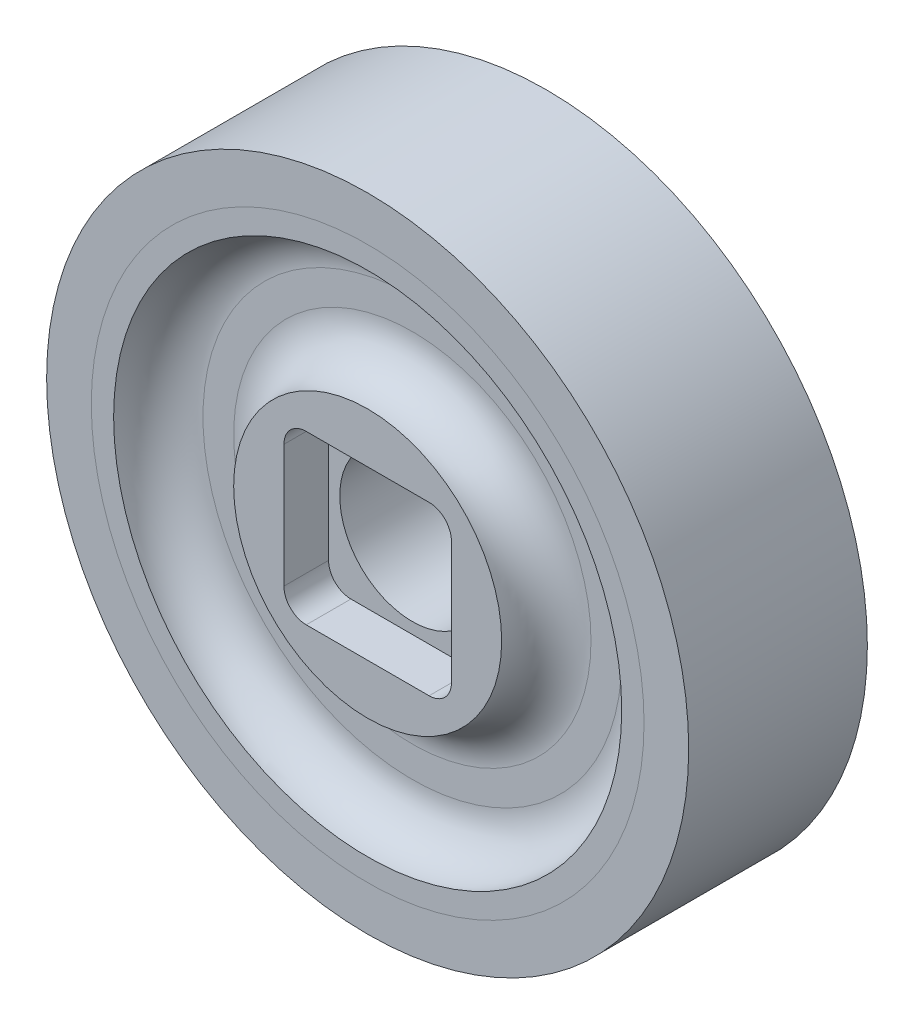
ISO-10303-21;
HEADER;
FILE_DESCRIPTION(('STEP AP214'),'2;1');
FILE_NAME('part.step','',(''),(''),'','','');
FILE_SCHEMA(('AUTOMOTIVE_DESIGN { 1 0 10303 214 1 1 1 1 }'));
ENDSEC;
DATA;
#1=APPLICATION_CONTEXT('core data for automotive mechanical design processes');
#2=APPLICATION_PROTOCOL_DEFINITION('international standard','automotive_design',2000,#1);
#3=PRODUCT_CONTEXT('',#1,'mechanical');
#4=PRODUCT('Part','Part','',(#3));
#5=PRODUCT_RELATED_PRODUCT_CATEGORY('part','',(#4));
#6=PRODUCT_DEFINITION_FORMATION('','',#4);
#7=PRODUCT_DEFINITION_CONTEXT('part definition',#1,'design');
#8=PRODUCT_DEFINITION('design','',#6,#7);
#9=PRODUCT_DEFINITION_SHAPE('','',#8);
#10=(LENGTH_UNIT() NAMED_UNIT(*) SI_UNIT(.MILLI.,.METRE.));
#11=(NAMED_UNIT(*) PLANE_ANGLE_UNIT() SI_UNIT($,.RADIAN.));
#12=(NAMED_UNIT(*) SI_UNIT($,.STERADIAN.) SOLID_ANGLE_UNIT());
#13=UNCERTAINTY_MEASURE_WITH_UNIT(LENGTH_MEASURE(1.E-05),#10,'distance_accuracy_value','');
#14=(GEOMETRIC_REPRESENTATION_CONTEXT(3) GLOBAL_UNCERTAINTY_ASSIGNED_CONTEXT((#13)) GLOBAL_UNIT_ASSIGNED_CONTEXT((#10,
#11,#12)) REPRESENTATION_CONTEXT('',''));
#15=CARTESIAN_POINT('',(0.,0.,0.));
#16=DIRECTION('',(0.,0.,1.));
#17=DIRECTION('',(1.,0.,0.));
#18=AXIS2_PLACEMENT_3D('',#15,#16,#17);
#19=CARTESIAN_POINT('',(0.,36.5125,10.16));
#20=DIRECTION('',(0.,0.,-1.));
#21=DIRECTION('',(-1.,0.,0.));
#22=AXIS2_PLACEMENT_3D('',#19,#20,#21);
#23=PLANE('',#22);
#24=CARTESIAN_POINT('',(0.,0.,10.16));
#25=DIRECTION('',(0.,0.,1.));
#26=DIRECTION('',(1.,0.,0.));
#27=AXIS2_PLACEMENT_3D('',#24,#25,#26);
#28=CIRCLE('',#27,31.4325);
#29=CARTESIAN_POINT('',(31.4325,0.,10.16));
#30=VERTEX_POINT('',#29);
#31=EDGE_CURVE('E11',#30,#30,#28,.T.);
#32=ORIENTED_EDGE('',*,*,#31,.F.);
#33=EDGE_LOOP('',(#32));
#34=FACE_BOUND('',#33,.T.);
#35=CARTESIAN_POINT('',(0.,0.,10.16));
#36=DIRECTION('',(0.,0.,1.));
#37=DIRECTION('',(1.,0.,0.));
#38=AXIS2_PLACEMENT_3D('',#35,#36,#37);
#39=CIRCLE('',#38,36.5125);
#40=CARTESIAN_POINT('',(36.5125,0.,10.16));
#41=VERTEX_POINT('',#40);
#42=EDGE_CURVE('E70',#41,#41,#39,.T.);
#43=ORIENTED_EDGE('',*,*,#42,.T.);
#44=EDGE_LOOP('',(#43));
#45=FACE_BOUND('',#44,.T.);
#46=ADVANCED_FACE('F42',(#34,#45),#23,.F.);
#47=CARTESIAN_POINT('',(0.,0.,72.4842508034882));
#48=DIRECTION('',(0.,0.,1.));
#49=DIRECTION('',(1.,0.,0.));
#50=AXIS2_PLACEMENT_3D('',#47,#48,#49);
#51=CYLINDRICAL_SURFACE('',#50,31.4325);
#52=CARTESIAN_POINT('',(0.,0.,5.08));
#53=DIRECTION('',(0.,0.,1.));
#54=DIRECTION('',(1.,0.,0.));
#55=AXIS2_PLACEMENT_3D('',#52,#53,#54);
#56=CIRCLE('',#55,31.4325);
#57=CARTESIAN_POINT('',(31.4325,0.,5.08));
#58=VERTEX_POINT('',#57);
#59=EDGE_CURVE('E48',#58,#58,#56,.T.);
#60=ORIENTED_EDGE('',*,*,#59,.F.);
#61=EDGE_LOOP('',(#60));
#62=FACE_BOUND('',#61,.T.);
#63=ORIENTED_EDGE('',*,*,#31,.T.);
#64=EDGE_LOOP('',(#63));
#65=FACE_BOUND('',#64,.T.);
#66=ADVANCED_FACE('F107',(#62,#65),#51,.F.);
#67=CARTESIAN_POINT('',(0.,31.4325,5.08));
#68=DIRECTION('',(0.,0.,1.));
#69=DIRECTION('',(1.,0.,0.));
#70=AXIS2_PLACEMENT_3D('',#67,#68,#69);
#71=PLANE('',#70);
#72=CARTESIAN_POINT('',(0.,0.,5.07999999999999));
#73=DIRECTION('',(0.,0.,1.));
#74=DIRECTION('',(1.,0.,0.));
#75=AXIS2_PLACEMENT_3D('',#72,#73,#74);
#76=CIRCLE('',#75,34.1249);
#77=CARTESIAN_POINT('',(34.1249,0.,5.07999999999999));
#78=VERTEX_POINT('',#77);
#79=EDGE_CURVE('E52',#78,#78,#76,.T.);
#80=ORIENTED_EDGE('',*,*,#79,.F.);
#81=EDGE_LOOP('',(#80));
#82=FACE_BOUND('',#81,.T.);
#83=ORIENTED_EDGE('',*,*,#59,.T.);
#84=EDGE_LOOP('',(#83));
#85=FACE_BOUND('',#84,.T.);
#86=ADVANCED_FACE('F102',(#82,#85),#71,.F.);
#87=CARTESIAN_POINT('',(0.,0.,72.4842508034882));
#88=DIRECTION('',(0.,0.,1.));
#89=DIRECTION('',(1.,0.,0.));
#90=AXIS2_PLACEMENT_3D('',#87,#88,#89);
#91=CYLINDRICAL_SURFACE('',#90,34.1249);
#92=CARTESIAN_POINT('',(0.,0.,-5.08));
#93=DIRECTION('',(0.,0.,1.));
#94=DIRECTION('',(1.,0.,0.));
#95=AXIS2_PLACEMENT_3D('',#92,#93,#94);
#96=CIRCLE('',#95,34.1249);
#97=CARTESIAN_POINT('',(34.1249,0.,-5.08));
#98=VERTEX_POINT('',#97);
#99=EDGE_CURVE('E56',#98,#98,#96,.T.);
#100=ORIENTED_EDGE('',*,*,#99,.F.);
#101=EDGE_LOOP('',(#100));
#102=FACE_BOUND('',#101,.T.);
#103=ORIENTED_EDGE('',*,*,#79,.T.);
#104=EDGE_LOOP('',(#103));
#105=FACE_BOUND('',#104,.T.);
#106=ADVANCED_FACE('F96',(#102,#105),#91,.F.);
#107=CARTESIAN_POINT('',(0.,34.1249,-5.08));
#108=DIRECTION('',(0.,0.,-1.));
#109=DIRECTION('',(-1.,0.,0.));
#110=AXIS2_PLACEMENT_3D('',#107,#108,#109);
#111=PLANE('',#110);
#112=CARTESIAN_POINT('',(0.,0.,-5.08));
#113=DIRECTION('',(0.,0.,1.));
#114=DIRECTION('',(1.,0.,0.));
#115=AXIS2_PLACEMENT_3D('',#112,#113,#114);
#116=CIRCLE('',#115,31.4325);
#117=CARTESIAN_POINT('',(31.4325,0.,-5.08));
#118=VERTEX_POINT('',#117);
#119=EDGE_CURVE('E61',#118,#118,#116,.T.);
#120=ORIENTED_EDGE('',*,*,#119,.F.);
#121=EDGE_LOOP('',(#120));
#122=FACE_BOUND('',#121,.T.);
#123=ORIENTED_EDGE('',*,*,#99,.T.);
#124=EDGE_LOOP('',(#123));
#125=FACE_BOUND('',#124,.T.);
#126=ADVANCED_FACE('F90',(#122,#125),#111,.F.);
#127=CARTESIAN_POINT('',(0.,0.,72.4842508034882));
#128=DIRECTION('',(0.,0.,1.));
#129=DIRECTION('',(1.,0.,0.));
#130=AXIS2_PLACEMENT_3D('',#127,#128,#129);
#131=CYLINDRICAL_SURFACE('',#130,31.4325);
#132=CARTESIAN_POINT('',(0.,0.,-10.16));
#133=DIRECTION('',(0.,0.,1.));
#134=DIRECTION('',(1.,0.,0.));
#135=AXIS2_PLACEMENT_3D('',#132,#133,#134);
#136=CIRCLE('',#135,31.4325);
#137=CARTESIAN_POINT('',(31.4325,0.,-10.16));
#138=VERTEX_POINT('',#137);
#139=EDGE_CURVE('E64',#138,#138,#136,.T.);
#140=ORIENTED_EDGE('',*,*,#139,.F.);
#141=EDGE_LOOP('',(#140));
#142=FACE_BOUND('',#141,.T.);
#143=ORIENTED_EDGE('',*,*,#119,.T.);
#144=EDGE_LOOP('',(#143));
#145=FACE_BOUND('',#144,.T.);
#146=ADVANCED_FACE('F84',(#142,#145),#131,.F.);
#147=CARTESIAN_POINT('',(0.,31.4325,-10.16));
#148=DIRECTION('',(0.,0.,1.));
#149=DIRECTION('',(1.,0.,0.));
#150=AXIS2_PLACEMENT_3D('',#147,#148,#149);
#151=PLANE('',#150);
#152=CARTESIAN_POINT('',(0.,0.,-10.16));
#153=DIRECTION('',(0.,0.,1.));
#154=DIRECTION('',(1.,0.,0.));
#155=AXIS2_PLACEMENT_3D('',#152,#153,#154);
#156=CIRCLE('',#155,36.5125);
#157=CARTESIAN_POINT('',(36.5125,0.,-10.16));
#158=VERTEX_POINT('',#157);
#159=EDGE_CURVE('E67',#158,#158,#156,.T.);
#160=ORIENTED_EDGE('',*,*,#159,.F.);
#161=EDGE_LOOP('',(#160));
#162=FACE_BOUND('',#161,.T.);
#163=ORIENTED_EDGE('',*,*,#139,.T.);
#164=EDGE_LOOP('',(#163));
#165=FACE_BOUND('',#164,.T.);
#166=ADVANCED_FACE('F78',(#162,#165),#151,.F.);
#167=CARTESIAN_POINT('',(0.,0.,72.4842508034882));
#168=DIRECTION('',(0.,0.,1.));
#169=DIRECTION('',(1.,0.,0.));
#170=AXIS2_PLACEMENT_3D('',#167,#168,#169);
#171=CYLINDRICAL_SURFACE('',#170,36.5125);
#172=ORIENTED_EDGE('',*,*,#42,.F.);
#173=EDGE_LOOP('',(#172));
#174=FACE_BOUND('',#173,.T.);
#175=ORIENTED_EDGE('',*,*,#159,.T.);
#176=EDGE_LOOP('',(#175));
#177=FACE_BOUND('',#176,.T.);
#178=ADVANCED_FACE('F75',(#174,#177),#171,.T.);
#179=CLOSED_SHELL('',(#46,#66,#86,#106,#126,#146,#166,#178));
#180=MANIFOLD_SOLID_BREP('B2',#179);
#181=CARTESIAN_POINT('',(0.,0.,10.16));
#182=DIRECTION('',(0.,0.,-1.));
#183=DIRECTION('',(-1.,0.,0.));
#184=AXIS2_PLACEMENT_3D('',#181,#182,#183);
#185=PLANE('',#184);
#186=CARTESIAN_POINT('',(0.,0.,10.16));
#187=DIRECTION('',(0.,0.,1.));
#188=DIRECTION('',(1.,0.,0.));
#189=AXIS2_PLACEMENT_3D('',#186,#187,#188);
#190=CIRCLE('',#189,28.8925);
#191=CARTESIAN_POINT('',(28.8925,0.,10.16));
#192=VERTEX_POINT('',#191);
#193=EDGE_CURVE('E306',#192,#192,#190,.T.);
#194=ORIENTED_EDGE('',*,*,#193,.F.);
#195=EDGE_LOOP('',(#194));
#196=FACE_BOUND('',#195,.T.);
#197=CARTESIAN_POINT('',(0.,0.,10.16));
#198=DIRECTION('',(0.,0.,1.));
#199=DIRECTION('',(1.,0.,0.));
#200=AXIS2_PLACEMENT_3D('',#197,#198,#199);
#201=CIRCLE('',#200,31.4325);
#202=CARTESIAN_POINT('',(31.4325,0.,10.16));
#203=VERTEX_POINT('',#202);
#204=EDGE_CURVE('E267',#203,#203,#201,.T.);
#205=ORIENTED_EDGE('',*,*,#204,.T.);
#206=EDGE_LOOP('',(#205));
#207=FACE_BOUND('',#206,.T.);
#208=ADVANCED_FACE('F163',(#196,#207),#185,.F.);
#209=CARTESIAN_POINT('',(0.,0.,10.16));
#210=DIRECTION('',(0.,0.,1.));
#211=DIRECTION('',(1.,0.,0.));
#212=AXIS2_PLACEMENT_3D('',#209,#210,#211);
#213=TOROIDAL_SURFACE('',#212,23.8125,5.08);
#214=CARTESIAN_POINT('',(0.,0.,5.08));
#215=DIRECTION('',(0.,0.,1.));
#216=DIRECTION('',(1.,0.,0.));
#217=AXIS2_PLACEMENT_3D('',#214,#215,#216);
#218=CIRCLE('',#217,23.8125);
#219=CARTESIAN_POINT('',(23.8125,0.,5.08));
#220=VERTEX_POINT('',#219);
#221=EDGE_CURVE('E303',#220,#220,#218,.T.);
#222=ORIENTED_EDGE('',*,*,#221,.F.);
#223=EDGE_LOOP('',(#222));
#224=FACE_BOUND('',#223,.T.);
#225=ORIENTED_EDGE('',*,*,#193,.T.);
#226=EDGE_LOOP('',(#225));
#227=FACE_BOUND('',#226,.T.);
#228=ADVANCED_FACE('F369',(#224,#227),#213,.F.);
#229=CARTESIAN_POINT('',(0.,0.,5.08000000000001));
#230=DIRECTION('',(0.,0.,-1.));
#231=DIRECTION('',(-1.,0.,0.));
#232=AXIS2_PLACEMENT_3D('',#229,#230,#231);
#233=PLANE('',#232);
#234=CARTESIAN_POINT('',(0.,0.,5.08000000000001));
#235=DIRECTION('',(0.,0.,1.));
#236=DIRECTION('',(1.,0.,0.));
#237=AXIS2_PLACEMENT_3D('',#234,#235,#236);
#238=CIRCLE('',#237,20.32);
#239=CARTESIAN_POINT('',(20.32,0.,5.08000000000001));
#240=VERTEX_POINT('',#239);
#241=EDGE_CURVE('E300',#240,#240,#238,.T.);
#242=ORIENTED_EDGE('',*,*,#241,.F.);
#243=EDGE_LOOP('',(#242));
#244=FACE_BOUND('',#243,.T.);
#245=ORIENTED_EDGE('',*,*,#221,.T.);
#246=EDGE_LOOP('',(#245));
#247=FACE_BOUND('',#246,.T.);
#248=ADVANCED_FACE('F375',(#244,#247),#233,.F.);
#249=CARTESIAN_POINT('',(0.,0.,10.16));
#250=DIRECTION('',(0.,0.,1.));
#251=DIRECTION('',(1.,0.,0.));
#252=AXIS2_PLACEMENT_3D('',#249,#250,#251);
#253=TOROIDAL_SURFACE('',#252,20.32,5.07999999999999);
#254=CARTESIAN_POINT('',(0.,0.,10.16));
#255=DIRECTION('',(0.,0.,1.));
#256=DIRECTION('',(1.,0.,0.));
#257=AXIS2_PLACEMENT_3D('',#254,#255,#256);
#258=CIRCLE('',#257,15.24);
#259=CARTESIAN_POINT('',(15.24,0.,10.16));
#260=VERTEX_POINT('',#259);
#261=EDGE_CURVE('E297',#260,#260,#258,.T.);
#262=ORIENTED_EDGE('',*,*,#261,.F.);
#263=EDGE_LOOP('',(#262));
#264=FACE_BOUND('',#263,.T.);
#265=ORIENTED_EDGE('',*,*,#241,.T.);
#266=EDGE_LOOP('',(#265));
#267=FACE_BOUND('',#266,.T.);
#268=ADVANCED_FACE('F460',(#264,#267),#253,.F.);
#269=CARTESIAN_POINT('',(0.,0.,10.16));
#270=DIRECTION('',(0.,0.,1.));
#271=DIRECTION('',(1.,0.,0.));
#272=AXIS2_PLACEMENT_3D('',#269,#270,#271);
#273=PLANE('',#272);
#274=DIRECTION('',(0.,1.,0.));
#275=VECTOR('',#274,1.);
#276=CARTESIAN_POINT('',(9.525,-9.525,10.16));
#277=LINE('',#276,#275);
#278=CARTESIAN_POINT('',(9.525,-6.985,10.16));
#279=VERTEX_POINT('',#278);
#280=CARTESIAN_POINT('',(9.525,6.98499999999999,10.16));
#281=VERTEX_POINT('',#280);
#282=EDGE_CURVE('E243',#279,#281,#277,.T.);
#283=ORIENTED_EDGE('',*,*,#282,.F.);
#284=CARTESIAN_POINT('',(6.985,-6.985,10.16));
#285=DIRECTION('',(0.,0.,1.));
#286=DIRECTION('',(1.,0.,0.));
#287=AXIS2_PLACEMENT_3D('',#284,#285,#286);
#288=CIRCLE('',#287,2.54);
#289=CARTESIAN_POINT('',(6.98499999999999,-9.525,10.16));
#290=VERTEX_POINT('',#289);
#291=EDGE_CURVE('E227',#279,#290,#288,.F.);
#292=ORIENTED_EDGE('',*,*,#291,.T.);
#293=DIRECTION('',(1.,0.,0.));
#294=VECTOR('',#293,1.);
#295=CARTESIAN_POINT('',(-9.525,-9.525,10.16));
#296=LINE('',#295,#294);
#297=CARTESIAN_POINT('',(-6.985,-9.525,10.16));
#298=VERTEX_POINT('',#297);
#299=EDGE_CURVE('E265',#298,#290,#296,.T.);
#300=ORIENTED_EDGE('',*,*,#299,.F.);
#301=CARTESIAN_POINT('',(-6.985,-6.985,10.16));
#302=DIRECTION('',(0.,0.,1.));
#303=DIRECTION('',(1.,0.,0.));
#304=AXIS2_PLACEMENT_3D('',#301,#302,#303);
#305=CIRCLE('',#304,2.54);
#306=CARTESIAN_POINT('',(-9.525,-6.985,10.16));
#307=VERTEX_POINT('',#306);
#308=EDGE_CURVE('E236',#298,#307,#305,.F.);
#309=ORIENTED_EDGE('',*,*,#308,.T.);
#310=DIRECTION('',(0.,-1.,0.));
#311=VECTOR('',#310,1.);
#312=CARTESIAN_POINT('',(-9.525,-9.525,10.16));
#313=LINE('',#312,#311);
#314=CARTESIAN_POINT('',(-9.525,6.98499999999999,10.16));
#315=VERTEX_POINT('',#314);
#316=EDGE_CURVE('E254',#315,#307,#313,.T.);
#317=ORIENTED_EDGE('',*,*,#316,.F.);
#318=CARTESIAN_POINT('',(-6.985,6.985,10.16));
#319=DIRECTION('',(0.,0.,1.));
#320=DIRECTION('',(1.,0.,0.));
#321=AXIS2_PLACEMENT_3D('',#318,#319,#320);
#322=CIRCLE('',#321,2.54);
#323=CARTESIAN_POINT('',(-6.985,9.525,10.16));
#324=VERTEX_POINT('',#323);
#325=EDGE_CURVE('E171',#315,#324,#322,.F.);
#326=ORIENTED_EDGE('',*,*,#325,.T.);
#327=DIRECTION('',(-1.,0.,0.));
#328=VECTOR('',#327,1.);
#329=CARTESIAN_POINT('',(-9.525,9.525,10.16));
#330=LINE('',#329,#328);
#331=CARTESIAN_POINT('',(6.98499999999999,9.525,10.16));
#332=VERTEX_POINT('',#331);
#333=EDGE_CURVE('E251',#332,#324,#330,.T.);
#334=ORIENTED_EDGE('',*,*,#333,.F.);
#335=CARTESIAN_POINT('',(6.985,6.985,10.16));
#336=DIRECTION('',(0.,0.,1.));
#337=DIRECTION('',(1.,0.,0.));
#338=AXIS2_PLACEMENT_3D('',#335,#336,#337);
#339=CIRCLE('',#338,2.54);
#340=EDGE_CURVE('E40',#332,#281,#339,.F.);
#341=ORIENTED_EDGE('',*,*,#340,.T.);
#342=EDGE_LOOP('',(#283,#292,#300,#309,#317,#326,#334,#341));
#343=FACE_BOUND('',#342,.T.);
#344=ORIENTED_EDGE('',*,*,#261,.T.);
#345=EDGE_LOOP('',(#344));
#346=FACE_BOUND('',#345,.T.);
#347=ADVANCED_FACE('F249',(#343,#346),#273,.T.);
#348=CARTESIAN_POINT('',(0.,0.,-10.16));
#349=DIRECTION('',(0.,0.,1.));
#350=DIRECTION('',(1.,0.,0.));
#351=AXIS2_PLACEMENT_3D('',#348,#349,#350);
#352=PLANE('',#351);
#353=CARTESIAN_POINT('',(0.,0.,-10.16));
#354=DIRECTION('',(0.,0.,1.));
#355=DIRECTION('',(1.,0.,0.));
#356=AXIS2_PLACEMENT_3D('',#353,#354,#355);
#357=CIRCLE('',#356,8.255);
#358=CARTESIAN_POINT('',(8.255,0.,-10.16));
#359=VERTEX_POINT('',#358);
#360=EDGE_CURVE('E252',#359,#359,#357,.T.);
#361=ORIENTED_EDGE('',*,*,#360,.T.);
#362=EDGE_LOOP('',(#361));
#363=FACE_BOUND('',#362,.T.);
#364=CARTESIAN_POINT('',(0.,0.,-10.16));
#365=DIRECTION('',(0.,0.,1.));
#366=DIRECTION('',(1.,0.,0.));
#367=AXIS2_PLACEMENT_3D('',#364,#365,#366);
#368=CIRCLE('',#367,15.24);
#369=CARTESIAN_POINT('',(15.24,0.,-10.16));
#370=VERTEX_POINT('',#369);
#371=EDGE_CURVE('E294',#370,#370,#368,.T.);
#372=ORIENTED_EDGE('',*,*,#371,.F.);
#373=EDGE_LOOP('',(#372));
#374=FACE_BOUND('',#373,.T.);
#375=ADVANCED_FACE('F459',(#363,#374),#352,.F.);
#376=CARTESIAN_POINT('',(0.,0.,-10.16));
#377=DIRECTION('',(0.,0.,1.));
#378=DIRECTION('',(1.,0.,0.));
#379=AXIS2_PLACEMENT_3D('',#376,#377,#378);
#380=TOROIDAL_SURFACE('',#379,20.32,5.07999999999999);
#381=ORIENTED_EDGE('',*,*,#371,.T.);
#382=EDGE_LOOP('',(#381));
#383=FACE_BOUND('',#382,.T.);
#384=CARTESIAN_POINT('',(0.,0.,-5.08000000000002));
#385=DIRECTION('',(0.,0.,1.));
#386=DIRECTION('',(1.,0.,0.));
#387=AXIS2_PLACEMENT_3D('',#384,#385,#386);
#388=CIRCLE('',#387,20.32);
#389=CARTESIAN_POINT('',(20.32,0.,-5.08000000000002));
#390=VERTEX_POINT('',#389);
#391=EDGE_CURVE('E291',#390,#390,#388,.T.);
#392=ORIENTED_EDGE('',*,*,#391,.F.);
#393=EDGE_LOOP('',(#392));
#394=FACE_BOUND('',#393,.T.);
#395=ADVANCED_FACE('F476',(#383,#394),#380,.F.);
#396=CARTESIAN_POINT('',(0.,0.,-5.08000000000001));
#397=DIRECTION('',(0.,0.,-1.));
#398=DIRECTION('',(-1.,0.,0.));
#399=AXIS2_PLACEMENT_3D('',#396,#397,#398);
#400=PLANE('',#399);
#401=ORIENTED_EDGE('',*,*,#391,.T.);
#402=EDGE_LOOP('',(#401));
#403=FACE_BOUND('',#402,.T.);
#404=CARTESIAN_POINT('',(0.,0.,-5.08));
#405=DIRECTION('',(0.,0.,1.));
#406=DIRECTION('',(1.,0.,0.));
#407=AXIS2_PLACEMENT_3D('',#404,#405,#406);
#408=CIRCLE('',#407,23.8125);
#409=CARTESIAN_POINT('',(23.8125,0.,-5.08));
#410=VERTEX_POINT('',#409);
#411=EDGE_CURVE('E288',#410,#410,#408,.T.);
#412=ORIENTED_EDGE('',*,*,#411,.F.);
#413=EDGE_LOOP('',(#412));
#414=FACE_BOUND('',#413,.T.);
#415=ADVANCED_FACE('F546',(#403,#414),#400,.T.);
#416=CARTESIAN_POINT('',(0.,0.,-10.16));
#417=DIRECTION('',(0.,0.,1.));
#418=DIRECTION('',(1.,0.,0.));
#419=AXIS2_PLACEMENT_3D('',#416,#417,#418);
#420=TOROIDAL_SURFACE('',#419,23.8125,5.08);
#421=ORIENTED_EDGE('',*,*,#411,.T.);
#422=EDGE_LOOP('',(#421));
#423=FACE_BOUND('',#422,.T.);
#424=CARTESIAN_POINT('',(0.,0.,-10.16));
#425=DIRECTION('',(0.,0.,1.));
#426=DIRECTION('',(1.,0.,0.));
#427=AXIS2_PLACEMENT_3D('',#424,#425,#426);
#428=CIRCLE('',#427,28.8925);
#429=CARTESIAN_POINT('',(28.8925,0.,-10.16));
#430=VERTEX_POINT('',#429);
#431=EDGE_CURVE('E285',#430,#430,#428,.T.);
#432=ORIENTED_EDGE('',*,*,#431,.F.);
#433=EDGE_LOOP('',(#432));
#434=FACE_BOUND('',#433,.T.);
#435=ADVANCED_FACE('F536',(#423,#434),#420,.F.);
#436=CARTESIAN_POINT('',(0.,0.,-10.16));
#437=DIRECTION('',(0.,0.,-1.));
#438=DIRECTION('',(-1.,0.,0.));
#439=AXIS2_PLACEMENT_3D('',#436,#437,#438);
#440=PLANE('',#439);
#441=ORIENTED_EDGE('',*,*,#431,.T.);
#442=EDGE_LOOP('',(#441));
#443=FACE_BOUND('',#442,.T.);
#444=CARTESIAN_POINT('',(0.,0.,-10.16));
#445=DIRECTION('',(0.,0.,1.));
#446=DIRECTION('',(1.,0.,0.));
#447=AXIS2_PLACEMENT_3D('',#444,#445,#446);
#448=CIRCLE('',#447,31.4325);
#449=CARTESIAN_POINT('',(31.4325,0.,-10.16));
#450=VERTEX_POINT('',#449);
#451=EDGE_CURVE('E282',#450,#450,#448,.T.);
#452=ORIENTED_EDGE('',*,*,#451,.F.);
#453=EDGE_LOOP('',(#452));
#454=FACE_BOUND('',#453,.T.);
#455=ADVANCED_FACE('F526',(#443,#454),#440,.T.);
#456=CARTESIAN_POINT('',(0.,0.,33.9907146888817));
#457=DIRECTION('',(0.,0.,1.));
#458=DIRECTION('',(1.,0.,0.));
#459=AXIS2_PLACEMENT_3D('',#456,#457,#458);
#460=CYLINDRICAL_SURFACE('',#459,31.4325);
#461=ORIENTED_EDGE('',*,*,#451,.T.);
#462=EDGE_LOOP('',(#461));
#463=FACE_BOUND('',#462,.T.);
#464=CARTESIAN_POINT('',(0.,0.,-5.08));
#465=DIRECTION('',(0.,0.,1.));
#466=DIRECTION('',(1.,0.,0.));
#467=AXIS2_PLACEMENT_3D('',#464,#465,#466);
#468=CIRCLE('',#467,31.4325);
#469=CARTESIAN_POINT('',(31.4325,0.,-5.08));
#470=VERTEX_POINT('',#469);
#471=EDGE_CURVE('E279',#470,#470,#468,.T.);
#472=ORIENTED_EDGE('',*,*,#471,.F.);
#473=EDGE_LOOP('',(#472));
#474=FACE_BOUND('',#473,.T.);
#475=ADVANCED_FACE('F516',(#463,#474),#460,.T.);
#476=CARTESIAN_POINT('',(0.,0.,-5.08));
#477=DIRECTION('',(0.,0.,-1.));
#478=DIRECTION('',(-1.,0.,0.));
#479=AXIS2_PLACEMENT_3D('',#476,#477,#478);
#480=PLANE('',#479);
#481=ORIENTED_EDGE('',*,*,#471,.T.);
#482=EDGE_LOOP('',(#481));
#483=FACE_BOUND('',#482,.T.);
#484=CARTESIAN_POINT('',(0.,0.,-5.07999999999999));
#485=DIRECTION('',(0.,0.,1.));
#486=DIRECTION('',(1.,0.,0.));
#487=AXIS2_PLACEMENT_3D('',#484,#485,#486);
#488=CIRCLE('',#487,34.1249);
#489=CARTESIAN_POINT('',(34.1249,0.,-5.07999999999999));
#490=VERTEX_POINT('',#489);
#491=EDGE_CURVE('E276',#490,#490,#488,.T.);
#492=ORIENTED_EDGE('',*,*,#491,.F.);
#493=EDGE_LOOP('',(#492));
#494=FACE_BOUND('',#493,.T.);
#495=ADVANCED_FACE('F506',(#483,#494),#480,.T.);
#496=CARTESIAN_POINT('',(0.,0.,33.9907146888817));
#497=DIRECTION('',(0.,0.,1.));
#498=DIRECTION('',(1.,0.,0.));
#499=AXIS2_PLACEMENT_3D('',#496,#497,#498);
#500=CYLINDRICAL_SURFACE('',#499,34.1249);
#501=ORIENTED_EDGE('',*,*,#491,.T.);
#502=EDGE_LOOP('',(#501));
#503=FACE_BOUND('',#502,.T.);
#504=CARTESIAN_POINT('',(0.,0.,5.07999999999999));
#505=DIRECTION('',(0.,0.,1.));
#506=DIRECTION('',(1.,0.,0.));
#507=AXIS2_PLACEMENT_3D('',#504,#505,#506);
#508=CIRCLE('',#507,34.1249);
#509=CARTESIAN_POINT('',(34.1249,0.,5.07999999999999));
#510=VERTEX_POINT('',#509);
#511=EDGE_CURVE('E273',#510,#510,#508,.T.);
#512=ORIENTED_EDGE('',*,*,#511,.F.);
#513=EDGE_LOOP('',(#512));
#514=FACE_BOUND('',#513,.T.);
#515=ADVANCED_FACE('F496',(#503,#514),#500,.T.);
#516=CARTESIAN_POINT('',(0.,0.,5.08));
#517=DIRECTION('',(0.,0.,-1.));
#518=DIRECTION('',(-1.,0.,0.));
#519=AXIS2_PLACEMENT_3D('',#516,#517,#518);
#520=PLANE('',#519);
#521=CARTESIAN_POINT('',(0.,0.,5.08));
#522=DIRECTION('',(0.,0.,1.));
#523=DIRECTION('',(1.,0.,0.));
#524=AXIS2_PLACEMENT_3D('',#521,#522,#523);
#525=CIRCLE('',#524,31.4325);
#526=CARTESIAN_POINT('',(31.4325,0.,5.08));
#527=VERTEX_POINT('',#526);
#528=EDGE_CURVE('E270',#527,#527,#525,.T.);
#529=ORIENTED_EDGE('',*,*,#528,.F.);
#530=EDGE_LOOP('',(#529));
#531=FACE_BOUND('',#530,.T.);
#532=ORIENTED_EDGE('',*,*,#511,.T.);
#533=EDGE_LOOP('',(#532));
#534=FACE_BOUND('',#533,.T.);
#535=ADVANCED_FACE('F486',(#531,#534),#520,.F.);
#536=CARTESIAN_POINT('',(0.,0.,33.9907146888817));
#537=DIRECTION('',(0.,0.,1.));
#538=DIRECTION('',(1.,0.,0.));
#539=AXIS2_PLACEMENT_3D('',#536,#537,#538);
#540=CYLINDRICAL_SURFACE('',#539,31.4325);
#541=ORIENTED_EDGE('',*,*,#204,.F.);
#542=EDGE_LOOP('',(#541));
#543=FACE_BOUND('',#542,.T.);
#544=ORIENTED_EDGE('',*,*,#528,.T.);
#545=EDGE_LOOP('',(#544));
#546=FACE_BOUND('',#545,.T.);
#547=ADVANCED_FACE('F448',(#543,#546),#540,.T.);
#548=CARTESIAN_POINT('',(9.525,-9.525,5.08000000000001));
#549=DIRECTION('',(1.,0.,0.));
#550=DIRECTION('',(0.,0.,-1.));
#551=AXIS2_PLACEMENT_3D('',#548,#549,#550);
#552=PLANE('',#551);
#553=DIRECTION('',(0.,1.,0.));
#554=VECTOR('',#553,1.);
#555=CARTESIAN_POINT('',(9.525,-9.525,5.08000000000001));
#556=LINE('',#555,#554);
#557=CARTESIAN_POINT('',(9.525,-6.985,5.08000000000001));
#558=VERTEX_POINT('',#557);
#559=CARTESIAN_POINT('',(9.525,6.98499999999999,5.08000000000001));
#560=VERTEX_POINT('',#559);
#561=EDGE_CURVE('E245',#558,#560,#556,.T.);
#562=ORIENTED_EDGE('',*,*,#561,.F.);
#563=DIRECTION('',(0.,0.,1.));
#564=VECTOR('',#563,1.);
#565=CARTESIAN_POINT('',(9.525,-6.985,10.16));
#566=LINE('',#565,#564);
#567=EDGE_CURVE('E231',#558,#279,#566,.T.);
#568=ORIENTED_EDGE('',*,*,#567,.T.);
#569=ORIENTED_EDGE('',*,*,#282,.T.);
#570=DIRECTION('',(0.,0.,1.));
#571=VECTOR('',#570,1.);
#572=CARTESIAN_POINT('',(9.525,6.985,5.08000000000001));
#573=LINE('',#572,#571);
#574=EDGE_CURVE('E247',#281,#560,#573,.F.);
#575=ORIENTED_EDGE('',*,*,#574,.T.);
#576=EDGE_LOOP('',(#562,#568,#569,#575));
#577=FACE_BOUND('',#576,.T.);
#578=ADVANCED_FACE('F242',(#577),#552,.F.);
#579=CARTESIAN_POINT('',(-9.525,-9.525,5.08000000000001));
#580=DIRECTION('',(0.,-1.,0.));
#581=DIRECTION('',(0.,0.,-1.));
#582=AXIS2_PLACEMENT_3D('',#579,#580,#581);
#583=PLANE('',#582);
#584=ORIENTED_EDGE('',*,*,#299,.T.);
#585=DIRECTION('',(0.,0.,1.));
#586=VECTOR('',#585,1.);
#587=CARTESIAN_POINT('',(6.985,-9.525,5.08000000000001));
#588=LINE('',#587,#586);
#589=CARTESIAN_POINT('',(6.98499999999999,-9.525,5.08000000000001));
#590=VERTEX_POINT('',#589);
#591=EDGE_CURVE('E232',#290,#590,#588,.F.);
#592=ORIENTED_EDGE('',*,*,#591,.T.);
#593=DIRECTION('',(1.,0.,0.));
#594=VECTOR('',#593,1.);
#595=CARTESIAN_POINT('',(-9.525,-9.525,5.08000000000001));
#596=LINE('',#595,#594);
#597=CARTESIAN_POINT('',(-6.985,-9.525,5.08000000000001));
#598=VERTEX_POINT('',#597);
#599=EDGE_CURVE('E260',#598,#590,#596,.T.);
#600=ORIENTED_EDGE('',*,*,#599,.F.);
#601=DIRECTION('',(0.,0.,1.));
#602=VECTOR('',#601,1.);
#603=CARTESIAN_POINT('',(-6.985,-9.525,10.16));
#604=LINE('',#603,#602);
#605=EDGE_CURVE('E246',#598,#298,#604,.T.);
#606=ORIENTED_EDGE('',*,*,#605,.T.);
#607=EDGE_LOOP('',(#584,#592,#600,#606));
#608=FACE_BOUND('',#607,.T.);
#609=ADVANCED_FACE('F345',(#608),#583,.F.);
#610=CARTESIAN_POINT('',(-9.525,-9.525,5.08000000000001));
#611=DIRECTION('',(-1.,0.,0.));
#612=DIRECTION('',(0.,0.,1.));
#613=AXIS2_PLACEMENT_3D('',#610,#611,#612);
#614=PLANE('',#613);
#615=ORIENTED_EDGE('',*,*,#316,.T.);
#616=DIRECTION('',(0.,0.,1.));
#617=VECTOR('',#616,1.);
#618=CARTESIAN_POINT('',(-9.525,-6.985,5.08000000000001));
#619=LINE('',#618,#617);
#620=CARTESIAN_POINT('',(-9.525,-6.985,5.08000000000001));
#621=VERTEX_POINT('',#620);
#622=EDGE_CURVE('E324',#307,#621,#619,.F.);
#623=ORIENTED_EDGE('',*,*,#622,.T.);
#624=DIRECTION('',(0.,-1.,0.));
#625=VECTOR('',#624,1.);
#626=CARTESIAN_POINT('',(-9.525,-9.525,5.08000000000001));
#627=LINE('',#626,#625);
#628=CARTESIAN_POINT('',(-9.525,6.98499999999999,5.08000000000001));
#629=VERTEX_POINT('',#628);
#630=EDGE_CURVE('E343',#629,#621,#627,.T.);
#631=ORIENTED_EDGE('',*,*,#630,.F.);
#632=DIRECTION('',(0.,0.,1.));
#633=VECTOR('',#632,1.);
#634=CARTESIAN_POINT('',(-9.525,6.985,10.16));
#635=LINE('',#634,#633);
#636=EDGE_CURVE('E321',#629,#315,#635,.T.);
#637=ORIENTED_EDGE('',*,*,#636,.T.);
#638=EDGE_LOOP('',(#615,#623,#631,#637));
#639=FACE_BOUND('',#638,.T.);
#640=ADVANCED_FACE('F333',(#639),#614,.F.);
#641=CARTESIAN_POINT('',(-9.525,9.525,5.08000000000001));
#642=DIRECTION('',(0.,1.,0.));
#643=DIRECTION('',(0.,0.,1.));
#644=AXIS2_PLACEMENT_3D('',#641,#642,#643);
#645=PLANE('',#644);
#646=ORIENTED_EDGE('',*,*,#333,.T.);
#647=DIRECTION('',(0.,0.,1.));
#648=VECTOR('',#647,1.);
#649=CARTESIAN_POINT('',(-6.985,9.525,5.08000000000001));
#650=LINE('',#649,#648);
#651=CARTESIAN_POINT('',(-6.985,9.525,5.08000000000001));
#652=VERTEX_POINT('',#651);
#653=EDGE_CURVE('E237',#324,#652,#650,.F.);
#654=ORIENTED_EDGE('',*,*,#653,.T.);
#655=DIRECTION('',(-1.,0.,0.));
#656=VECTOR('',#655,1.);
#657=CARTESIAN_POINT('',(-9.525,9.525,5.08000000000001));
#658=LINE('',#657,#656);
#659=CARTESIAN_POINT('',(6.98499999999999,9.525,5.08000000000001));
#660=VERTEX_POINT('',#659);
#661=EDGE_CURVE('E346',#660,#652,#658,.T.);
#662=ORIENTED_EDGE('',*,*,#661,.F.);
#663=DIRECTION('',(0.,0.,1.));
#664=VECTOR('',#663,1.);
#665=CARTESIAN_POINT('',(6.985,9.525,10.16));
#666=LINE('',#665,#664);
#667=EDGE_CURVE('E326',#660,#332,#666,.T.);
#668=ORIENTED_EDGE('',*,*,#667,.T.);
#669=EDGE_LOOP('',(#646,#654,#662,#668));
#670=FACE_BOUND('',#669,.T.);
#671=ADVANCED_FACE('F357',(#670),#645,.F.);
#672=CARTESIAN_POINT('',(0.,0.,5.08000000000001));
#673=DIRECTION('',(0.,0.,-1.));
#674=DIRECTION('',(-1.,0.,0.));
#675=AXIS2_PLACEMENT_3D('',#672,#673,#674);
#676=PLANE('',#675);
#677=CARTESIAN_POINT('',(0.,0.,5.08000000000001));
#678=DIRECTION('',(0.,0.,1.));
#679=DIRECTION('',(1.,0.,0.));
#680=AXIS2_PLACEMENT_3D('',#677,#678,#679);
#681=CIRCLE('',#680,8.255);
#682=CARTESIAN_POINT('',(8.255,0.,5.08000000000001));
#683=VERTEX_POINT('',#682);
#684=EDGE_CURVE('E257',#683,#683,#681,.T.);
#685=ORIENTED_EDGE('',*,*,#684,.F.);
#686=EDGE_LOOP('',(#685));
#687=FACE_BOUND('',#686,.T.);
#688=ORIENTED_EDGE('',*,*,#599,.T.);
#689=CARTESIAN_POINT('',(6.985,-6.985,5.08000000000001));
#690=DIRECTION('',(0.,0.,-1.));
#691=DIRECTION('',(-1.,0.,0.));
#692=AXIS2_PLACEMENT_3D('',#689,#690,#691);
#693=CIRCLE('',#692,2.54);
#694=EDGE_CURVE('E319',#590,#558,#693,.F.);
#695=ORIENTED_EDGE('',*,*,#694,.T.);
#696=ORIENTED_EDGE('',*,*,#561,.T.);
#697=CARTESIAN_POINT('',(6.985,6.985,5.08000000000001));
#698=DIRECTION('',(0.,0.,-1.));
#699=DIRECTION('',(-1.,0.,0.));
#700=AXIS2_PLACEMENT_3D('',#697,#698,#699);
#701=CIRCLE('',#700,2.54);
#702=EDGE_CURVE('E313',#560,#660,#701,.F.);
#703=ORIENTED_EDGE('',*,*,#702,.T.);
#704=ORIENTED_EDGE('',*,*,#661,.T.);
#705=CARTESIAN_POINT('',(-6.985,6.985,5.08000000000001));
#706=DIRECTION('',(0.,0.,-1.));
#707=DIRECTION('',(-1.,0.,0.));
#708=AXIS2_PLACEMENT_3D('',#705,#706,#707);
#709=CIRCLE('',#708,2.54);
#710=EDGE_CURVE('E315',#652,#629,#709,.F.);
#711=ORIENTED_EDGE('',*,*,#710,.T.);
#712=ORIENTED_EDGE('',*,*,#630,.T.);
#713=CARTESIAN_POINT('',(-6.985,-6.985,5.08000000000001));
#714=DIRECTION('',(0.,0.,-1.));
#715=DIRECTION('',(-1.,0.,0.));
#716=AXIS2_PLACEMENT_3D('',#713,#714,#715);
#717=CIRCLE('',#716,2.54);
#718=EDGE_CURVE('E317',#621,#598,#717,.F.);
#719=ORIENTED_EDGE('',*,*,#718,.T.);
#720=EDGE_LOOP('',(#688,#695,#696,#703,#704,#711,#712,#719));
#721=FACE_BOUND('',#720,.T.);
#722=ADVANCED_FACE('F342',(#687,#721),#676,.F.);
#723=CARTESIAN_POINT('',(0.,0.,-10.16));
#724=DIRECTION('',(0.,0.,1.));
#725=DIRECTION('',(1.,0.,0.));
#726=AXIS2_PLACEMENT_3D('',#723,#724,#725);
#727=CYLINDRICAL_SURFACE('',#726,8.255);
#728=ORIENTED_EDGE('',*,*,#360,.F.);
#729=EDGE_LOOP('',(#728));
#730=FACE_BOUND('',#729,.T.);
#731=ORIENTED_EDGE('',*,*,#684,.T.);
#732=EDGE_LOOP('',(#731));
#733=FACE_BOUND('',#732,.T.);
#734=ADVANCED_FACE('F354',(#730,#733),#727,.F.);
#735=CARTESIAN_POINT('',(6.985,-6.985,5.08000000000001));
#736=DIRECTION('',(0.,0.,-1.));
#737=DIRECTION('',(-1.,0.,0.));
#738=AXIS2_PLACEMENT_3D('',#735,#736,#737);
#739=CYLINDRICAL_SURFACE('',#738,2.54);
#740=ORIENTED_EDGE('',*,*,#694,.F.);
#741=ORIENTED_EDGE('',*,*,#591,.F.);
#742=ORIENTED_EDGE('',*,*,#291,.F.);
#743=ORIENTED_EDGE('',*,*,#567,.F.);
#744=EDGE_LOOP('',(#740,#741,#742,#743));
#745=FACE_BOUND('',#744,.T.);
#746=ADVANCED_FACE('F230',(#745),#739,.F.);
#747=CARTESIAN_POINT('',(-6.985,-6.985,5.08000000000001));
#748=DIRECTION('',(0.,0.,-1.));
#749=DIRECTION('',(-1.,0.,0.));
#750=AXIS2_PLACEMENT_3D('',#747,#748,#749);
#751=CYLINDRICAL_SURFACE('',#750,2.54);
#752=ORIENTED_EDGE('',*,*,#718,.F.);
#753=ORIENTED_EDGE('',*,*,#622,.F.);
#754=ORIENTED_EDGE('',*,*,#308,.F.);
#755=ORIENTED_EDGE('',*,*,#605,.F.);
#756=EDGE_LOOP('',(#752,#753,#754,#755));
#757=FACE_BOUND('',#756,.T.);
#758=ADVANCED_FACE('F338',(#757),#751,.F.);
#759=CARTESIAN_POINT('',(-6.985,6.985,5.08000000000001));
#760=DIRECTION('',(0.,0.,-1.));
#761=DIRECTION('',(-1.,0.,0.));
#762=AXIS2_PLACEMENT_3D('',#759,#760,#761);
#763=CYLINDRICAL_SURFACE('',#762,2.54);
#764=ORIENTED_EDGE('',*,*,#710,.F.);
#765=ORIENTED_EDGE('',*,*,#653,.F.);
#766=ORIENTED_EDGE('',*,*,#325,.F.);
#767=ORIENTED_EDGE('',*,*,#636,.F.);
#768=EDGE_LOOP('',(#764,#765,#766,#767));
#769=FACE_BOUND('',#768,.T.);
#770=ADVANCED_FACE('F385',(#769),#763,.F.);
#771=CARTESIAN_POINT('',(6.985,6.985,5.08000000000001));
#772=DIRECTION('',(0.,0.,-1.));
#773=DIRECTION('',(-1.,0.,0.));
#774=AXIS2_PLACEMENT_3D('',#771,#772,#773);
#775=CYLINDRICAL_SURFACE('',#774,2.54);
#776=ORIENTED_EDGE('',*,*,#702,.F.);
#777=ORIENTED_EDGE('',*,*,#574,.F.);
#778=ORIENTED_EDGE('',*,*,#340,.F.);
#779=ORIENTED_EDGE('',*,*,#667,.F.);
#780=EDGE_LOOP('',(#776,#777,#778,#779));
#781=FACE_BOUND('',#780,.T.);
#782=ADVANCED_FACE('F165',(#781),#775,.F.);
#783=CLOSED_SHELL('',(#208,#228,#248,#268,#347,#375,#395,#415,#435,#455,#475,#495,#515,#535,
#547,#578,#609,#640,#671,#722,#734,#746,#758,#770,#782));
#784=MANIFOLD_SOLID_BREP('B6',#783);
#785=ADVANCED_BREP_SHAPE_REPRESENTATION('',(#18,#180,#784),#14);
#786=SHAPE_DEFINITION_REPRESENTATION(#9,#785);
ENDSEC;
END-ISO-10303-21;
